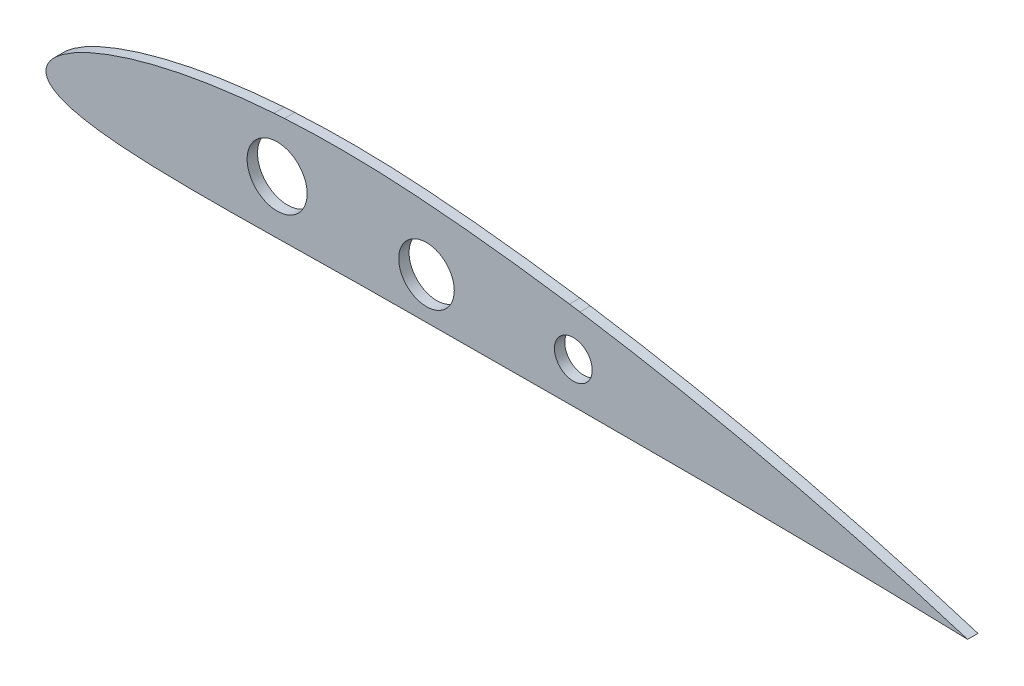
ISO-10303-21;
HEADER;
FILE_DESCRIPTION(('STEP AP214'),'2;1');
FILE_NAME('part.step','',(''),(''),'','','');
FILE_SCHEMA(('AUTOMOTIVE_DESIGN { 1 0 10303 214 1 1 1 1 }'));
ENDSEC;
DATA;
#1=APPLICATION_CONTEXT('core data for automotive mechanical design processes');
#2=APPLICATION_PROTOCOL_DEFINITION('international standard','automotive_design',2000,#1);
#3=PRODUCT_CONTEXT('',#1,'mechanical');
#4=PRODUCT('Part','Part','',(#3));
#5=PRODUCT_RELATED_PRODUCT_CATEGORY('part','',(#4));
#6=PRODUCT_DEFINITION_FORMATION('','',#4);
#7=PRODUCT_DEFINITION_CONTEXT('part definition',#1,'design');
#8=PRODUCT_DEFINITION('design','',#6,#7);
#9=PRODUCT_DEFINITION_SHAPE('','',#8);
#10=(LENGTH_UNIT() NAMED_UNIT(*) SI_UNIT(.MILLI.,.METRE.));
#11=(NAMED_UNIT(*) PLANE_ANGLE_UNIT() SI_UNIT($,.RADIAN.));
#12=(NAMED_UNIT(*) SI_UNIT($,.STERADIAN.) SOLID_ANGLE_UNIT());
#13=UNCERTAINTY_MEASURE_WITH_UNIT(LENGTH_MEASURE(1.E-05),#10,'distance_accuracy_value','');
#14=(GEOMETRIC_REPRESENTATION_CONTEXT(3) GLOBAL_UNCERTAINTY_ASSIGNED_CONTEXT((#13)) GLOBAL_UNIT_ASSIGNED_CONTEXT((#10,
#11,#12)) REPRESENTATION_CONTEXT('',''));
#15=CARTESIAN_POINT('',(0.,0.,0.));
#16=DIRECTION('',(0.,0.,1.));
#17=DIRECTION('',(1.,0.,0.));
#18=AXIS2_PLACEMENT_3D('',#15,#16,#17);
#19=CARTESIAN_POINT('',(149.894619256414,106.854755989877,1.4));
#20=CARTESIAN_POINT('',(158.680275082572,106.889957074756,1.4));
#21=CARTESIAN_POINT('',(176.251614136073,106.916321204518,1.4));
#22=CARTESIAN_POINT('',(202.609661936218,106.73064533298,1.4));
#23=CARTESIAN_POINT('',(228.96468105988,106.292568252224,1.4));
#24=CARTESIAN_POINT('',(246.530526636941,105.850587700062,1.4));
#25=CARTESIAN_POINT('',(255.312881654357,105.60676111473,1.4));
#26=B_SPLINE_CURVE_WITH_KNOTS('',3,(#19,#20,#21,#22,#23,#24,#25),.UNSPECIFIED.,.F.,.F.,(4,1,1,1,
4),(0.581490104405728,0.685469054372265,0.789448004338803,0.89342695430534,0.997405904271877),.UNSPECIFIED.);
#27=DIRECTION('',(0.,0.,-1.));
#28=VECTOR('',#27,1.);
#29=SURFACE_OF_LINEAR_EXTRUSION('',#26,#28);
#30=CARTESIAN_POINT('',(149.894619256414,106.854755989877,-1.4));
#31=CARTESIAN_POINT('',(158.680275082572,106.889957074756,-1.4));
#32=CARTESIAN_POINT('',(176.251614136073,106.916321204518,-1.4));
#33=CARTESIAN_POINT('',(202.609661936218,106.73064533298,-1.4));
#34=CARTESIAN_POINT('',(228.96468105988,106.292568252224,-1.4));
#35=CARTESIAN_POINT('',(246.530526636941,105.850587700062,-1.4));
#36=CARTESIAN_POINT('',(255.312881654357,105.60676111473,-1.4));
#37=B_SPLINE_CURVE_WITH_KNOTS('',3,(#30,#31,#32,#33,#34,#35,#36),.UNSPECIFIED.,.F.,.F.,(4,1,1,1,
4),(0.581490104405728,0.685469054372265,0.789448004338803,0.89342695430534,0.997405904271877),.UNSPECIFIED.);
#38=CARTESIAN_POINT('',(149.894619256414,106.854755989877,-1.4));
#39=VERTEX_POINT('',#38);
#40=CARTESIAN_POINT('',(255.312881654357,105.60676111473,-1.4));
#41=VERTEX_POINT('',#40);
#42=EDGE_CURVE('E268',#39,#41,#37,.T.);
#43=ORIENTED_EDGE('',*,*,#42,.T.);
#44=DIRECTION('',(0.,0.,-1.));
#45=VECTOR('',#44,1.);
#46=CARTESIAN_POINT('',(255.312881654357,105.60676111473,1.4));
#47=LINE('',#46,#45);
#48=CARTESIAN_POINT('',(255.312881654357,105.60676111473,1.4));
#49=VERTEX_POINT('',#48);
#50=EDGE_CURVE('E11',#49,#41,#47,.T.);
#51=ORIENTED_EDGE('',*,*,#50,.F.);
#52=CARTESIAN_POINT('',(149.894619256414,106.854755989877,1.4));
#53=VERTEX_POINT('',#52);
#54=EDGE_CURVE('E212',#53,#49,#26,.T.);
#55=ORIENTED_EDGE('',*,*,#54,.F.);
#56=DIRECTION('',(0.,0.,-1.));
#57=VECTOR('',#56,1.);
#58=CARTESIAN_POINT('',(149.894619256414,106.854755989877,1.4));
#59=LINE('',#58,#57);
#60=EDGE_CURVE('E142',#53,#39,#59,.T.);
#61=ORIENTED_EDGE('',*,*,#60,.T.);
#62=EDGE_LOOP('',(#43,#51,#55,#61));
#63=FACE_BOUND('',#62,.T.);
#64=ADVANCED_FACE('F37',(#63),#29,.F.);
#65=CARTESIAN_POINT('',(255.312881654358,105.60676111473,1.4));
#66=CARTESIAN_POINT('',(246.756257413018,108.260896884077,1.4));
#67=CARTESIAN_POINT('',(229.54444233678,113.256971155102,1.4));
#68=CARTESIAN_POINT('',(203.47024089322,119.799788090143,1.4));
#69=CARTESIAN_POINT('',(177.178570900204,125.40441699623,1.4));
#70=CARTESIAN_POINT('',(159.522198848407,128.478032217996,1.4));
#71=CARTESIAN_POINT('',(150.666396797955,129.829620390137,1.4));
#72=B_SPLINE_CURVE_WITH_KNOTS('',3,(#65,#66,#67,#68,#69,#70,#71),.UNSPECIFIED.,.F.,.F.,(4,1,1,1,
4),(0.00222757964376328,0.106325046268382,0.210422512893002,0.314519979517621,0.41861744614224),.UNSPECIFIED.);
#73=DIRECTION('',(0.,0.,-1.));
#74=VECTOR('',#73,1.);
#75=SURFACE_OF_LINEAR_EXTRUSION('',#72,#74);
#76=CARTESIAN_POINT('',(255.312881654358,105.60676111473,-1.4));
#77=CARTESIAN_POINT('',(246.756257413018,108.260896884077,-1.4));
#78=CARTESIAN_POINT('',(229.54444233678,113.256971155102,-1.4));
#79=CARTESIAN_POINT('',(203.47024089322,119.799788090143,-1.4));
#80=CARTESIAN_POINT('',(177.178570900204,125.40441699623,-1.4));
#81=CARTESIAN_POINT('',(159.522198848407,128.478032217996,-1.4));
#82=CARTESIAN_POINT('',(150.666396797955,129.829620390137,-1.4));
#83=B_SPLINE_CURVE_WITH_KNOTS('',3,(#76,#77,#78,#79,#80,#81,#82),.UNSPECIFIED.,.F.,.F.,(4,1,1,1,
4),(0.00222757964376328,0.106325046268382,0.210422512893002,0.314519979517621,0.41861744614224),.UNSPECIFIED.);
#84=CARTESIAN_POINT('',(150.666396797955,129.829620390137,-1.4));
#85=VERTEX_POINT('',#84);
#86=EDGE_CURVE('E262',#41,#85,#83,.T.);
#87=ORIENTED_EDGE('',*,*,#86,.T.);
#88=DIRECTION('',(0.,0.,-1.));
#89=VECTOR('',#88,1.);
#90=CARTESIAN_POINT('',(150.666396797955,129.829620390137,1.4));
#91=LINE('',#90,#89);
#92=CARTESIAN_POINT('',(150.666396797955,129.829620390137,1.4));
#93=VERTEX_POINT('',#92);
#94=EDGE_CURVE('E46',#93,#85,#91,.T.);
#95=ORIENTED_EDGE('',*,*,#94,.F.);
#96=EDGE_CURVE('E103',#49,#93,#72,.T.);
#97=ORIENTED_EDGE('',*,*,#96,.F.);
#98=ORIENTED_EDGE('',*,*,#50,.T.);
#99=EDGE_LOOP('',(#87,#95,#97,#98));
#100=FACE_BOUND('',#99,.T.);
#101=ADVANCED_FACE('F203',(#100),#75,.F.);
#102=CARTESIAN_POINT('',(22.4132301607229,149.108042258837,1.4));
#103=DIRECTION('',(-0.14864544722991,-0.988890555631825,0.));
#104=DIRECTION('',(0.988890555631825,-0.14864544722991,0.));
#105=AXIS2_PLACEMENT_3D('',#102,#103,#104);
#106=PLANE('',#105);
#107=DIRECTION('',(-0.988890555631825,0.14864544722991,0.));
#108=VECTOR('',#107,1.);
#109=CARTESIAN_POINT('',(22.4132301607229,149.108042258837,-1.4));
#110=LINE('',#109,#108);
#111=CARTESIAN_POINT('',(147.830444308953,130.25590763057,-1.4));
#112=VERTEX_POINT('',#111);
#113=EDGE_CURVE('E257',#85,#112,#110,.T.);
#114=ORIENTED_EDGE('',*,*,#113,.T.);
#115=DIRECTION('',(0.,0.,-1.));
#116=VECTOR('',#115,1.);
#117=CARTESIAN_POINT('',(147.830444308953,130.25590763057,1.4));
#118=LINE('',#117,#116);
#119=CARTESIAN_POINT('',(147.830444308953,130.25590763057,1.4));
#120=VERTEX_POINT('',#119);
#121=EDGE_CURVE('E251',#120,#112,#118,.T.);
#122=ORIENTED_EDGE('',*,*,#121,.F.);
#123=DIRECTION('',(-0.988890555631825,0.14864544722991,0.));
#124=VECTOR('',#123,1.);
#125=CARTESIAN_POINT('',(22.4132301607229,149.108042258837,1.4));
#126=LINE('',#125,#124);
#127=EDGE_CURVE('E189',#93,#120,#126,.T.);
#128=ORIENTED_EDGE('',*,*,#127,.F.);
#129=ORIENTED_EDGE('',*,*,#94,.T.);
#130=EDGE_LOOP('',(#114,#122,#128,#129));
#131=FACE_BOUND('',#130,.T.);
#132=ADVANCED_FACE('F199',(#131),#106,.F.);
#133=CARTESIAN_POINT('',(147.830444308953,130.25590763057,1.4));
#134=CARTESIAN_POINT('',(141.461413304036,131.198524365851,1.4));
#135=CARTESIAN_POINT('',(128.693359955321,132.886388705285,1.4));
#136=CARTESIAN_POINT('',(112.670431319567,134.46164524872,1.4));
#137=CARTESIAN_POINT('',(99.8269687406522,135.315000174992,1.4));
#138=CARTESIAN_POINT('',(86.9640203559628,135.731264376099,1.4));
#139=CARTESIAN_POINT('',(77.3083419090292,135.549477481379,1.4));
#140=CARTESIAN_POINT('',(70.8877326550715,135.171040435875,1.4));
#141=B_SPLINE_CURVE_WITH_KNOTS('',3,(#133,#134,#135,#136,#137,#138,#139,#140),.UNSPECIFIED.,.F.,
.F.,(4,1,1,1,1,4),(0.429725304294191,0.50454493038584,0.57936455647749,0.616774369523314,
0.654184182569139,0.729003808660788),.UNSPECIFIED.);
#142=DIRECTION('',(0.,0.,-1.));
#143=VECTOR('',#142,1.);
#144=SURFACE_OF_LINEAR_EXTRUSION('',#141,#143);
#145=CARTESIAN_POINT('',(147.830444308953,130.25590763057,-1.4));
#146=CARTESIAN_POINT('',(141.461413304036,131.198524365851,-1.4));
#147=CARTESIAN_POINT('',(128.693359955321,132.886388705285,-1.4));
#148=CARTESIAN_POINT('',(112.670431319567,134.46164524872,-1.4));
#149=CARTESIAN_POINT('',(99.8269687406522,135.315000174992,-1.4));
#150=CARTESIAN_POINT('',(86.9640203559628,135.731264376099,-1.4));
#151=CARTESIAN_POINT('',(77.3083419090292,135.549477481379,-1.4));
#152=CARTESIAN_POINT('',(70.8877326550715,135.171040435875,-1.4));
#153=B_SPLINE_CURVE_WITH_KNOTS('',3,(#145,#146,#147,#148,#149,#150,#151,#152),.UNSPECIFIED.,.F.,
.F.,(4,1,1,1,1,4),(0.429725304294191,0.50454493038584,0.57936455647749,0.616774369523314,
0.654184182569139,0.729003808660788),.UNSPECIFIED.);
#154=CARTESIAN_POINT('',(70.8877326550715,135.171040435875,-1.4));
#155=VERTEX_POINT('',#154);
#156=EDGE_CURVE('E264',#112,#155,#153,.T.);
#157=ORIENTED_EDGE('',*,*,#156,.T.);
#158=DIRECTION('',(0.,0.,-1.));
#159=VECTOR('',#158,1.);
#160=CARTESIAN_POINT('',(70.8877326550715,135.171040435875,1.4));
#161=LINE('',#160,#159);
#162=CARTESIAN_POINT('',(70.8877326550715,135.171040435875,1.4));
#163=VERTEX_POINT('',#162);
#164=EDGE_CURVE('E248',#163,#155,#161,.T.);
#165=ORIENTED_EDGE('',*,*,#164,.F.);
#166=EDGE_CURVE('E184',#120,#163,#141,.T.);
#167=ORIENTED_EDGE('',*,*,#166,.F.);
#168=ORIENTED_EDGE('',*,*,#121,.T.);
#169=EDGE_LOOP('',(#157,#165,#167,#168));
#170=FACE_BOUND('',#169,.T.);
#171=ADVANCED_FACE('F195',(#170),#144,.F.);
#172=CARTESIAN_POINT('',(-8.44678797017762,130.016927928256,1.4));
#173=DIRECTION('',(0.06483016250442,-0.99789631226378,0.));
#174=DIRECTION('',(0.99789631226378,0.06483016250442,0.));
#175=AXIS2_PLACEMENT_3D('',#172,#173,#174);
#176=PLANE('',#175);
#177=DIRECTION('',(-0.99789631226378,-0.06483016250442,0.));
#178=VECTOR('',#177,1.);
#179=CARTESIAN_POINT('',(-8.44678797017762,130.016927928256,-1.4));
#180=LINE('',#179,#178);
#181=CARTESIAN_POINT('',(68.0343243508861,134.985663536714,-1.4));
#182=VERTEX_POINT('',#181);
#183=EDGE_CURVE('E266',#155,#182,#180,.T.);
#184=ORIENTED_EDGE('',*,*,#183,.T.);
#185=DIRECTION('',(0.,0.,-1.));
#186=VECTOR('',#185,1.);
#187=CARTESIAN_POINT('',(68.0343243508861,134.985663536714,1.4));
#188=LINE('',#187,#186);
#189=CARTESIAN_POINT('',(68.0343243508861,134.985663536714,1.4));
#190=VERTEX_POINT('',#189);
#191=EDGE_CURVE('E245',#190,#182,#188,.T.);
#192=ORIENTED_EDGE('',*,*,#191,.F.);
#193=DIRECTION('',(-0.99789631226378,-0.06483016250442,0.));
#194=VECTOR('',#193,1.);
#195=CARTESIAN_POINT('',(-8.44678797017762,130.016927928256,1.4));
#196=LINE('',#195,#194);
#197=EDGE_CURVE('E179',#163,#190,#196,.T.);
#198=ORIENTED_EDGE('',*,*,#197,.F.);
#199=ORIENTED_EDGE('',*,*,#164,.T.);
#200=EDGE_LOOP('',(#184,#192,#198,#199));
#201=FACE_BOUND('',#200,.T.);
#202=ADVANCED_FACE('F198',(#201),#176,.F.);
#203=CARTESIAN_POINT('',(68.0343243508861,134.985663536714,1.4));
#204=CARTESIAN_POINT('',(62.4663272915128,134.590052618776,1.4));
#205=CARTESIAN_POINT('',(54.1287667732198,133.700155230356,1.4));
#206=CARTESIAN_POINT('',(43.125220572952,131.802909903816,1.4));
#207=CARTESIAN_POINT('',(34.9537761482906,129.977054103772,1.4));
#208=CARTESIAN_POINT('',(26.9071914758097,127.675989274361,1.4));
#209=CARTESIAN_POINT('',(20.3679809041667,125.262128548987,1.4));
#210=CARTESIAN_POINT('',(15.3365499347751,122.888373262699,1.4));
#211=CARTESIAN_POINT('',(11.7395607910426,120.808049658938,1.4));
#212=CARTESIAN_POINT('',(8.99153245879158,118.69641057424,1.4));
#213=CARTESIAN_POINT('',(7.48174934294299,116.88622792471,1.4));
#214=CARTESIAN_POINT('',(6.915411804354,115.858161553268,1.4));
#215=CARTESIAN_POINT('',(6.7078970409493,115.274334725607,1.4));
#216=CARTESIAN_POINT('',(6.62545754213481,114.936901914895,1.4));
#217=CARTESIAN_POINT('',(6.58542850054553,114.772902260157,1.4));
#218=B_SPLINE_CURVE_WITH_KNOTS('',3,(#203,#204,#205,#206,#207,#208,#209,#210,#211,#212,#213,
#214,#215,#216,#217),.UNSPECIFIED.,.F.,.F.,(4,1,1,1,1,1,1,1,1,1,1,1,4),(0.740090669371658,
0.805048089327921,0.837526799306053,0.870005509284185,0.902484219262317,0.934962929240448,
0.951202284229514,0.96744163921858,0.983680994207646,0.991800671702179,0.995860510449445,
0.997890429823078,0.999920349196711),.UNSPECIFIED.);
#219=DIRECTION('',(0.,0.,-1.));
#220=VECTOR('',#219,1.);
#221=SURFACE_OF_LINEAR_EXTRUSION('',#218,#220);
#222=CARTESIAN_POINT('',(68.0343243508861,134.985663536714,-1.4));
#223=CARTESIAN_POINT('',(62.4663272915128,134.590052618776,-1.4));
#224=CARTESIAN_POINT('',(54.1287667732198,133.700155230356,-1.4));
#225=CARTESIAN_POINT('',(43.125220572952,131.802909903816,-1.4));
#226=CARTESIAN_POINT('',(34.9537761482906,129.977054103772,-1.4));
#227=CARTESIAN_POINT('',(26.9071914758097,127.675989274361,-1.4));
#228=CARTESIAN_POINT('',(20.3679809041667,125.262128548987,-1.4));
#229=CARTESIAN_POINT('',(15.3365499347751,122.888373262699,-1.4));
#230=CARTESIAN_POINT('',(11.7395607910426,120.808049658938,-1.4));
#231=CARTESIAN_POINT('',(8.99153245879158,118.69641057424,-1.4));
#232=CARTESIAN_POINT('',(7.48174934294299,116.88622792471,-1.4));
#233=CARTESIAN_POINT('',(6.915411804354,115.858161553268,-1.4));
#234=CARTESIAN_POINT('',(6.7078970409493,115.274334725607,-1.4));
#235=CARTESIAN_POINT('',(6.62545754213481,114.936901914895,-1.4));
#236=CARTESIAN_POINT('',(6.58542850054553,114.772902260157,-1.4));
#237=B_SPLINE_CURVE_WITH_KNOTS('',3,(#222,#223,#224,#225,#226,#227,#228,#229,#230,#231,#232,
#233,#234,#235,#236),.UNSPECIFIED.,.F.,.F.,(4,1,1,1,1,1,1,1,1,1,1,1,4),(0.740090669371658,
0.805048089327921,0.837526799306053,0.870005509284185,0.902484219262317,0.934962929240448,
0.951202284229514,0.96744163921858,0.983680994207646,0.991800671702179,0.995860510449445,
0.997890429823078,0.999920349196711),.UNSPECIFIED.);
#238=CARTESIAN_POINT('',(6.58542850054553,114.772902260157,-1.4));
#239=VERTEX_POINT('',#238);
#240=EDGE_CURVE('E280',#182,#239,#237,.T.);
#241=ORIENTED_EDGE('',*,*,#240,.T.);
#242=DIRECTION('',(0.,0.,-1.));
#243=VECTOR('',#242,1.);
#244=CARTESIAN_POINT('',(6.58542850054553,114.772902260157,1.4));
#245=LINE('',#244,#243);
#246=CARTESIAN_POINT('',(6.58542850054553,114.772902260157,1.4));
#247=VERTEX_POINT('',#246);
#248=EDGE_CURVE('E242',#247,#239,#245,.T.);
#249=ORIENTED_EDGE('',*,*,#248,.F.);
#250=EDGE_CURVE('E171',#190,#247,#218,.T.);
#251=ORIENTED_EDGE('',*,*,#250,.F.);
#252=ORIENTED_EDGE('',*,*,#191,.T.);
#253=EDGE_LOOP('',(#241,#249,#251,#252));
#254=FACE_BOUND('',#253,.T.);
#255=ADVANCED_FACE('F164',(#254),#221,.F.);
#256=CARTESIAN_POINT('',(6.58542850054553,114.772902260157,1.4));
#257=CARTESIAN_POINT('',(6.56366414620477,114.614273347557,1.4));
#258=CARTESIAN_POINT('',(6.5190093469714,114.285406452402,1.4));
#259=CARTESIAN_POINT('',(6.51479072954578,113.710879009962,1.4));
#260=CARTESIAN_POINT('',(6.74189878291116,112.661535218991,1.4));
#261=CARTESIAN_POINT('',(7.66018429255603,111.409854012936,1.4));
#262=CARTESIAN_POINT('',(9.25908473021288,110.308268876171,1.4));
#263=CARTESIAN_POINT('',(11.044608156902,109.487380203342,1.4));
#264=CARTESIAN_POINT('',(12.9221944408203,108.850067693768,1.4));
#265=CARTESIAN_POINT('',(15.4901264572917,108.172753601497,1.4));
#266=CARTESIAN_POINT('',(18.7685029621804,107.558568006788,1.4));
#267=CARTESIAN_POINT('',(22.7454433758667,107.043168293996,1.4));
#268=CARTESIAN_POINT('',(28.0773130031014,106.557350361525,1.4));
#269=CARTESIAN_POINT('',(34.769590400056,106.213470374942,1.4));
#270=CARTESIAN_POINT('',(42.813490810935,106.037235573254,1.4));
#271=CARTESIAN_POINT('',(50.8626774800394,106.006056339145,1.4));
#272=CARTESIAN_POINT('',(58.9136155720875,106.062256394151,1.4));
#273=CARTESIAN_POINT('',(64.2820421930946,106.132538160557,1.4));
#274=CARTESIAN_POINT('',(66.9660117195889,106.171159396513,1.4));
#275=B_SPLINE_CURVE_WITH_KNOTS('',3,(#256,#257,#258,#259,#260,#261,#262,#263,#264,#265,#266,
#267,#268,#269,#270,#271,#272,#273,#274),.UNSPECIFIED.,.F.,.F.,(4,1,1,1,1,1,1,1,1,1,1,1,1,1,1,1,
4),(8.11675194704331E-05,0.00206730045466935,0.00405343338986826,0.00802569926026608,
0.0159702310010617,0.0239147627418574,0.031859294482653,0.0398038262234487,0.0477483579642443,
0.0636374214458356,0.0795264849274269,0.0954155484090183,0.127193675372201,0.158971802335383,
0.190749929298566,0.222528056261749,0.254306183224931),.UNSPECIFIED.);
#276=DIRECTION('',(0.,0.,-1.));
#277=VECTOR('',#276,1.);
#278=SURFACE_OF_LINEAR_EXTRUSION('',#275,#277);
#279=CARTESIAN_POINT('',(6.58542850054553,114.772902260157,-1.4));
#280=CARTESIAN_POINT('',(6.56366414620477,114.614273347557,-1.4));
#281=CARTESIAN_POINT('',(6.5190093469714,114.285406452402,-1.4));
#282=CARTESIAN_POINT('',(6.51479072954578,113.710879009962,-1.4));
#283=CARTESIAN_POINT('',(6.74189878291116,112.661535218991,-1.4));
#284=CARTESIAN_POINT('',(7.66018429255603,111.409854012936,-1.4));
#285=CARTESIAN_POINT('',(9.25908473021288,110.308268876171,-1.4));
#286=CARTESIAN_POINT('',(11.044608156902,109.487380203342,-1.4));
#287=CARTESIAN_POINT('',(12.9221944408203,108.850067693768,-1.4));
#288=CARTESIAN_POINT('',(15.4901264572917,108.172753601497,-1.4));
#289=CARTESIAN_POINT('',(18.7685029621804,107.558568006788,-1.4));
#290=CARTESIAN_POINT('',(22.7454433758667,107.043168293996,-1.4));
#291=CARTESIAN_POINT('',(28.0773130031014,106.557350361525,-1.4));
#292=CARTESIAN_POINT('',(34.769590400056,106.213470374942,-1.4));
#293=CARTESIAN_POINT('',(42.813490810935,106.037235573254,-1.4));
#294=CARTESIAN_POINT('',(50.8626774800394,106.006056339145,-1.4));
#295=CARTESIAN_POINT('',(58.9136155720875,106.062256394151,-1.4));
#296=CARTESIAN_POINT('',(64.2820421930946,106.132538160557,-1.4));
#297=CARTESIAN_POINT('',(66.9660117195889,106.171159396513,-1.4));
#298=B_SPLINE_CURVE_WITH_KNOTS('',3,(#279,#280,#281,#282,#283,#284,#285,#286,#287,#288,#289,
#290,#291,#292,#293,#294,#295,#296,#297),.UNSPECIFIED.,.F.,.F.,(4,1,1,1,1,1,1,1,1,1,1,1,1,1,1,1,
4),(8.11675194704331E-05,0.00206730045466935,0.00405343338986826,0.00802569926026608,
0.0159702310010617,0.0239147627418574,0.031859294482653,0.0398038262234487,0.0477483579642443,
0.0636374214458356,0.0795264849274269,0.0954155484090183,0.127193675372201,0.158971802335383,
0.190749929298566,0.222528056261749,0.254306183224931),.UNSPECIFIED.);
#299=CARTESIAN_POINT('',(66.9660117195889,106.171159396513,-1.4));
#300=VERTEX_POINT('',#299);
#301=EDGE_CURVE('E284',#239,#300,#298,.T.);
#302=ORIENTED_EDGE('',*,*,#301,.T.);
#303=DIRECTION('',(0.,0.,-1.));
#304=VECTOR('',#303,1.);
#305=CARTESIAN_POINT('',(66.9660117195889,106.171159396513,1.4));
#306=LINE('',#305,#304);
#307=CARTESIAN_POINT('',(66.9660117195889,106.171159396513,1.4));
#308=VERTEX_POINT('',#307);
#309=EDGE_CURVE('E137',#308,#300,#306,.T.);
#310=ORIENTED_EDGE('',*,*,#309,.F.);
#311=EDGE_CURVE('E128',#247,#308,#275,.T.);
#312=ORIENTED_EDGE('',*,*,#311,.F.);
#313=ORIENTED_EDGE('',*,*,#248,.T.);
#314=EDGE_LOOP('',(#302,#310,#312,#313));
#315=FACE_BOUND('',#314,.T.);
#316=ADVANCED_FACE('F161',(#315),#278,.F.);
#317=CARTESIAN_POINT('',(-1.55725848249838,105.156400011837,1.4));
#318=DIRECTION('',(-0.0148073512648334,0.999890365164361,0.));
#319=DIRECTION('',(-0.999890365164361,-0.0148073512648334,0.));
#320=AXIS2_PLACEMENT_3D('',#317,#318,#319);
#321=PLANE('',#320);
#322=DIRECTION('',(0.999890365164361,0.0148073512648334,0.));
#323=VECTOR('',#322,1.);
#324=CARTESIAN_POINT('',(-1.55725848249838,105.156400011837,-1.4));
#325=LINE('',#324,#323);
#326=CARTESIAN_POINT('',(69.8190690071352,106.213410250114,-1.4));
#327=VERTEX_POINT('',#326);
#328=EDGE_CURVE('E136',#300,#327,#325,.T.);
#329=ORIENTED_EDGE('',*,*,#328,.T.);
#330=DIRECTION('',(0.,0.,-1.));
#331=VECTOR('',#330,1.);
#332=CARTESIAN_POINT('',(69.8190690071352,106.213410250114,1.4));
#333=LINE('',#332,#331);
#334=CARTESIAN_POINT('',(69.8190690071352,106.213410250114,1.4));
#335=VERTEX_POINT('',#334);
#336=EDGE_CURVE('E133',#335,#327,#333,.T.);
#337=ORIENTED_EDGE('',*,*,#336,.F.);
#338=DIRECTION('',(0.999890365164361,0.0148073512648334,0.));
#339=VECTOR('',#338,1.);
#340=CARTESIAN_POINT('',(-1.55725848249838,105.156400011837,1.4));
#341=LINE('',#340,#339);
#342=EDGE_CURVE('E122',#308,#335,#341,.T.);
#343=ORIENTED_EDGE('',*,*,#342,.F.);
#344=ORIENTED_EDGE('',*,*,#309,.T.);
#345=EDGE_LOOP('',(#329,#337,#343,#344));
#346=FACE_BOUND('',#345,.T.);
#347=ADVANCED_FACE('F134',(#346),#321,.F.);
#348=CARTESIAN_POINT('',(69.8190690071352,106.213410250114,1.4));
#349=CARTESIAN_POINT('',(76.2538567327048,106.31100684137,1.4));
#350=CARTESIAN_POINT('',(85.9047948489214,106.47213737338,1.4));
#351=CARTESIAN_POINT('',(98.7779456737836,106.610759511662,1.4));
#352=CARTESIAN_POINT('',(111.651100899515,106.649514986469,1.4));
#353=CARTESIAN_POINT('',(127.735402572152,106.732475133212,1.4));
#354=CARTESIAN_POINT('',(140.606952956768,106.813706415112,1.4));
#355=CARTESIAN_POINT('',(147.042263767006,106.842620089855,1.4));
#356=B_SPLINE_CURVE_WITH_KNOTS('',3,(#348,#349,#350,#351,#352,#353,#354,#355),.UNSPECIFIED.,.F.,
.F.,(4,1,1,1,1,4),(0.265565078046195,0.341733084566208,0.379817087826214,0.41790109108622,
0.494069097606233,0.570237104126246),.UNSPECIFIED.);
#357=DIRECTION('',(0.,0.,-1.));
#358=VECTOR('',#357,1.);
#359=SURFACE_OF_LINEAR_EXTRUSION('',#356,#358);
#360=CARTESIAN_POINT('',(69.8190690071352,106.213410250114,-1.4));
#361=CARTESIAN_POINT('',(76.2538567327048,106.31100684137,-1.4));
#362=CARTESIAN_POINT('',(85.9047948489214,106.47213737338,-1.4));
#363=CARTESIAN_POINT('',(98.7779456737836,106.610759511662,-1.4));
#364=CARTESIAN_POINT('',(111.651100899515,106.649514986469,-1.4));
#365=CARTESIAN_POINT('',(127.735402572152,106.732475133212,-1.4));
#366=CARTESIAN_POINT('',(140.606952956768,106.813706415112,-1.4));
#367=CARTESIAN_POINT('',(147.042263767006,106.842620089855,-1.4));
#368=B_SPLINE_CURVE_WITH_KNOTS('',3,(#360,#361,#362,#363,#364,#365,#366,#367),.UNSPECIFIED.,.F.,
.F.,(4,1,1,1,1,4),(0.265565078046195,0.341733084566208,0.379817087826214,0.41790109108622,
0.494069097606233,0.570237104126246),.UNSPECIFIED.);
#369=CARTESIAN_POINT('',(147.042263767006,106.842620089855,-1.4));
#370=VERTEX_POINT('',#369);
#371=EDGE_CURVE('E89',#327,#370,#368,.T.);
#372=ORIENTED_EDGE('',*,*,#371,.T.);
#373=DIRECTION('',(0.,0.,-1.));
#374=VECTOR('',#373,1.);
#375=CARTESIAN_POINT('',(147.042263767006,106.842620089855,1.4));
#376=LINE('',#375,#374);
#377=CARTESIAN_POINT('',(147.042263767006,106.842620089855,1.4));
#378=VERTEX_POINT('',#377);
#379=EDGE_CURVE('E138',#378,#370,#376,.T.);
#380=ORIENTED_EDGE('',*,*,#379,.F.);
#381=EDGE_CURVE('E126',#335,#378,#356,.T.);
#382=ORIENTED_EDGE('',*,*,#381,.F.);
#383=ORIENTED_EDGE('',*,*,#336,.T.);
#384=EDGE_LOOP('',(#372,#380,#382,#383));
#385=FACE_BOUND('',#384,.T.);
#386=ADVANCED_FACE('F140',(#385),#359,.F.);
#387=CARTESIAN_POINT('',(68.9168426026147,120.636945020621,1.4));
#388=DIRECTION('',(0.,0.,-1.));
#389=DIRECTION('',(-1.,0.,0.));
#390=AXIS2_PLACEMENT_3D('',#387,#388,#389);
#391=CYLINDRICAL_SURFACE('',#390,8.10000000000001);
#392=CARTESIAN_POINT('',(68.9168426026147,120.636945020621,1.4));
#393=DIRECTION('',(0.,0.,1.));
#394=DIRECTION('',(1.,0.,0.));
#395=AXIS2_PLACEMENT_3D('',#392,#393,#394);
#396=CIRCLE('',#395,8.10000000000001);
#397=CARTESIAN_POINT('',(77.0168426026147,120.636945020621,1.4));
#398=VERTEX_POINT('',#397);
#399=EDGE_CURVE('E220',#398,#398,#396,.T.);
#400=ORIENTED_EDGE('',*,*,#399,.T.);
#401=EDGE_LOOP('',(#400));
#402=FACE_BOUND('',#401,.T.);
#403=CARTESIAN_POINT('',(68.9168426026147,120.636945020621,-1.4));
#404=DIRECTION('',(0.,0.,1.));
#405=DIRECTION('',(1.,0.,0.));
#406=AXIS2_PLACEMENT_3D('',#403,#404,#405);
#407=CIRCLE('',#406,8.10000000000001);
#408=CARTESIAN_POINT('',(77.0168426026147,120.636945020621,-1.4));
#409=VERTEX_POINT('',#408);
#410=EDGE_CURVE('E299',#409,#409,#407,.T.);
#411=ORIENTED_EDGE('',*,*,#410,.F.);
#412=EDGE_LOOP('',(#411));
#413=FACE_BOUND('',#412,.T.);
#414=ADVANCED_FACE('F156',(#402,#413),#391,.F.);
#415=CARTESIAN_POINT('',(109.232573951072,117.844985284419,1.4));
#416=DIRECTION('',(0.,0.,-1.));
#417=DIRECTION('',(-1.,0.,0.));
#418=AXIS2_PLACEMENT_3D('',#415,#416,#417);
#419=CYLINDRICAL_SURFACE('',#418,7.50000000000001);
#420=CARTESIAN_POINT('',(109.232573951072,117.844985284419,1.4));
#421=DIRECTION('',(0.,0.,1.));
#422=DIRECTION('',(1.,0.,0.));
#423=AXIS2_PLACEMENT_3D('',#420,#421,#422);
#424=CIRCLE('',#423,7.50000000000001);
#425=CARTESIAN_POINT('',(116.732573951072,117.844985284419,1.4));
#426=VERTEX_POINT('',#425);
#427=EDGE_CURVE('E226',#426,#426,#424,.T.);
#428=ORIENTED_EDGE('',*,*,#427,.T.);
#429=EDGE_LOOP('',(#428));
#430=FACE_BOUND('',#429,.T.);
#431=CARTESIAN_POINT('',(109.232573951072,117.844985284419,-1.4));
#432=DIRECTION('',(0.,0.,1.));
#433=DIRECTION('',(1.,0.,0.));
#434=AXIS2_PLACEMENT_3D('',#431,#432,#433);
#435=CIRCLE('',#434,7.50000000000001);
#436=CARTESIAN_POINT('',(116.732573951072,117.844985284419,-1.4));
#437=VERTEX_POINT('',#436);
#438=EDGE_CURVE('E301',#437,#437,#435,.T.);
#439=ORIENTED_EDGE('',*,*,#438,.F.);
#440=EDGE_LOOP('',(#439));
#441=FACE_BOUND('',#440,.T.);
#442=ADVANCED_FACE('F317',(#430,#441),#419,.F.);
#443=CARTESIAN_POINT('',(148.868108764142,117.844985284419,1.4));
#444=DIRECTION('',(0.,0.,-1.));
#445=DIRECTION('',(-1.,0.,0.));
#446=AXIS2_PLACEMENT_3D('',#443,#444,#445);
#447=CYLINDRICAL_SURFACE('',#446,5.09999999999998);
#448=CARTESIAN_POINT('',(148.868108764142,117.844985284419,1.4));
#449=DIRECTION('',(0.,0.,1.));
#450=DIRECTION('',(1.,0.,0.));
#451=AXIS2_PLACEMENT_3D('',#448,#449,#450);
#452=CIRCLE('',#451,5.09999999999998);
#453=CARTESIAN_POINT('',(153.968108764142,117.844985284419,1.4));
#454=VERTEX_POINT('',#453);
#455=EDGE_CURVE('E229',#454,#454,#452,.T.);
#456=ORIENTED_EDGE('',*,*,#455,.T.);
#457=EDGE_LOOP('',(#456));
#458=FACE_BOUND('',#457,.T.);
#459=CARTESIAN_POINT('',(148.868108764142,117.844985284419,-1.4));
#460=DIRECTION('',(0.,0.,1.));
#461=DIRECTION('',(1.,0.,0.));
#462=AXIS2_PLACEMENT_3D('',#459,#460,#461);
#463=CIRCLE('',#462,5.09999999999998);
#464=CARTESIAN_POINT('',(153.968108764142,117.844985284419,-1.4));
#465=VERTEX_POINT('',#464);
#466=EDGE_CURVE('E310',#465,#465,#463,.T.);
#467=ORIENTED_EDGE('',*,*,#466,.F.);
#468=EDGE_LOOP('',(#467));
#469=FACE_BOUND('',#468,.T.);
#470=ADVANCED_FACE('F39',(#458,#469),#447,.F.);
#471=CARTESIAN_POINT('',(-0.451912661683315,106.215077490182,1.4));
#472=DIRECTION('',(-0.00425465557301717,0.999990948912016,0.));
#473=DIRECTION('',(-0.999990948912016,-0.00425465557301717,0.));
#474=AXIS2_PLACEMENT_3D('',#471,#472,#473);
#475=PLANE('',#474);
#476=DIRECTION('',(0.999990948912017,0.00425465557301717,0.));
#477=VECTOR('',#476,1.);
#478=CARTESIAN_POINT('',(-0.451912661683315,106.215077490182,-1.4));
#479=LINE('',#478,#477);
#480=EDGE_CURVE('E95',#370,#39,#479,.T.);
#481=ORIENTED_EDGE('',*,*,#480,.T.);
#482=ORIENTED_EDGE('',*,*,#60,.F.);
#483=DIRECTION('',(0.999990948912017,0.00425465557301717,0.));
#484=VECTOR('',#483,1.);
#485=CARTESIAN_POINT('',(-0.451912661683315,106.215077490182,1.4));
#486=LINE('',#485,#484);
#487=EDGE_CURVE('E54',#378,#53,#486,.T.);
#488=ORIENTED_EDGE('',*,*,#487,.F.);
#489=ORIENTED_EDGE('',*,*,#379,.T.);
#490=EDGE_LOOP('',(#481,#482,#488,#489));
#491=FACE_BOUND('',#490,.T.);
#492=ADVANCED_FACE('F157',(#491),#475,.F.);
#493=CARTESIAN_POINT('',(0.,0.,1.4));
#494=DIRECTION('',(0.,0.,1.));
#495=DIRECTION('',(1.,0.,0.));
#496=AXIS2_PLACEMENT_3D('',#493,#494,#495);
#497=PLANE('',#496);
#498=ORIENTED_EDGE('',*,*,#455,.F.);
#499=EDGE_LOOP('',(#498));
#500=FACE_BOUND('',#499,.T.);
#501=ORIENTED_EDGE('',*,*,#427,.F.);
#502=EDGE_LOOP('',(#501));
#503=FACE_BOUND('',#502,.T.);
#504=ORIENTED_EDGE('',*,*,#399,.F.);
#505=EDGE_LOOP('',(#504));
#506=FACE_BOUND('',#505,.T.);
#507=ORIENTED_EDGE('',*,*,#54,.T.);
#508=ORIENTED_EDGE('',*,*,#96,.T.);
#509=ORIENTED_EDGE('',*,*,#127,.T.);
#510=ORIENTED_EDGE('',*,*,#166,.T.);
#511=ORIENTED_EDGE('',*,*,#197,.T.);
#512=ORIENTED_EDGE('',*,*,#250,.T.);
#513=ORIENTED_EDGE('',*,*,#311,.T.);
#514=ORIENTED_EDGE('',*,*,#342,.T.);
#515=ORIENTED_EDGE('',*,*,#381,.T.);
#516=ORIENTED_EDGE('',*,*,#487,.T.);
#517=EDGE_LOOP('',(#507,#508,#509,#510,#511,#512,#513,#514,#515,#516));
#518=FACE_BOUND('',#517,.T.);
#519=ADVANCED_FACE('F124',(#500,#503,#506,#518),#497,.T.);
#520=CARTESIAN_POINT('',(0.,0.,-1.4));
#521=DIRECTION('',(0.,0.,1.));
#522=DIRECTION('',(1.,0.,0.));
#523=AXIS2_PLACEMENT_3D('',#520,#521,#522);
#524=PLANE('',#523);
#525=ORIENTED_EDGE('',*,*,#466,.T.);
#526=EDGE_LOOP('',(#525));
#527=FACE_BOUND('',#526,.T.);
#528=ORIENTED_EDGE('',*,*,#438,.T.);
#529=EDGE_LOOP('',(#528));
#530=FACE_BOUND('',#529,.T.);
#531=ORIENTED_EDGE('',*,*,#410,.T.);
#532=EDGE_LOOP('',(#531));
#533=FACE_BOUND('',#532,.T.);
#534=ORIENTED_EDGE('',*,*,#42,.F.);
#535=ORIENTED_EDGE('',*,*,#480,.F.);
#536=ORIENTED_EDGE('',*,*,#371,.F.);
#537=ORIENTED_EDGE('',*,*,#328,.F.);
#538=ORIENTED_EDGE('',*,*,#301,.F.);
#539=ORIENTED_EDGE('',*,*,#240,.F.);
#540=ORIENTED_EDGE('',*,*,#183,.F.);
#541=ORIENTED_EDGE('',*,*,#156,.F.);
#542=ORIENTED_EDGE('',*,*,#113,.F.);
#543=ORIENTED_EDGE('',*,*,#86,.F.);
#544=EDGE_LOOP('',(#534,#535,#536,#537,#538,#539,#540,#541,#542,#543));
#545=FACE_BOUND('',#544,.T.);
#546=ADVANCED_FACE('F261',(#527,#530,#533,#545),#524,.F.);
#547=CLOSED_SHELL('',(#64,#101,#132,#171,#202,#255,#316,#347,#386,#414,#442,#470,#492,#519,#546));
#548=MANIFOLD_SOLID_BREP('B2',#547);
#549=ADVANCED_BREP_SHAPE_REPRESENTATION('',(#18,#548),#14);
#550=SHAPE_DEFINITION_REPRESENTATION(#9,#549);
ENDSEC;
END-ISO-10303-21;
